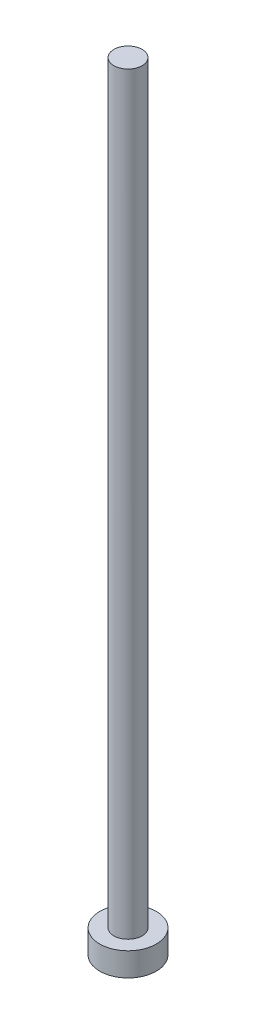
ISO-10303-21;
HEADER;
FILE_DESCRIPTION(('STEP AP214'),'2;1');
FILE_NAME('part.step','',(''),(''),'','','');
FILE_SCHEMA(('AUTOMOTIVE_DESIGN { 1 0 10303 214 1 1 1 1 }'));
ENDSEC;
DATA;
#1=APPLICATION_CONTEXT('core data for automotive mechanical design processes');
#2=APPLICATION_PROTOCOL_DEFINITION('international standard','automotive_design',2000,#1);
#3=PRODUCT_CONTEXT('',#1,'mechanical');
#4=PRODUCT('Part','Part','',(#3));
#5=PRODUCT_RELATED_PRODUCT_CATEGORY('part','',(#4));
#6=PRODUCT_DEFINITION_FORMATION('','',#4);
#7=PRODUCT_DEFINITION_CONTEXT('part definition',#1,'design');
#8=PRODUCT_DEFINITION('design','',#6,#7);
#9=PRODUCT_DEFINITION_SHAPE('','',#8);
#10=(LENGTH_UNIT() NAMED_UNIT(*) SI_UNIT(.MILLI.,.METRE.));
#11=(NAMED_UNIT(*) PLANE_ANGLE_UNIT() SI_UNIT($,.RADIAN.));
#12=(NAMED_UNIT(*) SI_UNIT($,.STERADIAN.) SOLID_ANGLE_UNIT());
#13=UNCERTAINTY_MEASURE_WITH_UNIT(LENGTH_MEASURE(1.E-05),#10,'distance_accuracy_value','');
#14=(GEOMETRIC_REPRESENTATION_CONTEXT(3) GLOBAL_UNCERTAINTY_ASSIGNED_CONTEXT((#13)) GLOBAL_UNIT_ASSIGNED_CONTEXT((#10,
#11,#12)) REPRESENTATION_CONTEXT('',''));
#15=CARTESIAN_POINT('',(0.,0.,0.));
#16=DIRECTION('',(0.,0.,1.));
#17=DIRECTION('',(1.,0.,0.));
#18=AXIS2_PLACEMENT_3D('',#15,#16,#17);
#19=CARTESIAN_POINT('',(0.,160.,0.));
#20=DIRECTION('',(0.,-1.,0.));
#21=DIRECTION('',(0.,0.,-1.));
#22=AXIS2_PLACEMENT_3D('',#19,#20,#21);
#23=CYLINDRICAL_SURFACE('',#22,3.);
#24=CARTESIAN_POINT('',(0.,160.,0.));
#25=DIRECTION('',(0.,1.,0.));
#26=DIRECTION('',(0.,0.,1.));
#27=AXIS2_PLACEMENT_3D('',#24,#25,#26);
#28=CIRCLE('',#27,3.);
#29=CARTESIAN_POINT('',(0.,160.,3.));
#30=VERTEX_POINT('',#29);
#31=EDGE_CURVE('E10',#30,#30,#28,.T.);
#32=ORIENTED_EDGE('',*,*,#31,.F.);
#33=EDGE_LOOP('',(#32));
#34=FACE_BOUND('',#33,.T.);
#35=CARTESIAN_POINT('',(0.,0.,0.));
#36=DIRECTION('',(0.,-1.,0.));
#37=DIRECTION('',(0.,0.,-1.));
#38=AXIS2_PLACEMENT_3D('',#35,#36,#37);
#39=CIRCLE('',#38,3.);
#40=CARTESIAN_POINT('',(0.,0.,-3.));
#41=VERTEX_POINT('',#40);
#42=EDGE_CURVE('E42',#41,#41,#39,.T.);
#43=ORIENTED_EDGE('',*,*,#42,.F.);
#44=EDGE_LOOP('',(#43));
#45=FACE_BOUND('',#44,.T.);
#46=ADVANCED_FACE('F36',(#34,#45),#23,.T.);
#47=CARTESIAN_POINT('',(0.,160.,0.));
#48=DIRECTION('',(0.,1.,0.));
#49=DIRECTION('',(0.,0.,1.));
#50=AXIS2_PLACEMENT_3D('',#47,#48,#49);
#51=PLANE('',#50);
#52=ORIENTED_EDGE('',*,*,#31,.T.);
#53=EDGE_LOOP('',(#52));
#54=FACE_BOUND('',#53,.T.);
#55=ADVANCED_FACE('F69',(#54),#51,.T.);
#56=CARTESIAN_POINT('',(0.,-5.,0.));
#57=DIRECTION('',(0.,1.,0.));
#58=DIRECTION('',(0.,0.,1.));
#59=AXIS2_PLACEMENT_3D('',#56,#57,#58);
#60=CYLINDRICAL_SURFACE('',#59,6.);
#61=CARTESIAN_POINT('',(0.,-5.,0.));
#62=DIRECTION('',(0.,-1.,0.));
#63=DIRECTION('',(0.,0.,-1.));
#64=AXIS2_PLACEMENT_3D('',#61,#62,#63);
#65=CIRCLE('',#64,6.);
#66=CARTESIAN_POINT('',(0.,-5.,-6.));
#67=VERTEX_POINT('',#66);
#68=EDGE_CURVE('E46',#67,#67,#65,.T.);
#69=ORIENTED_EDGE('',*,*,#68,.F.);
#70=EDGE_LOOP('',(#69));
#71=FACE_BOUND('',#70,.T.);
#72=CARTESIAN_POINT('',(0.,0.,0.));
#73=DIRECTION('',(0.,-1.,0.));
#74=DIRECTION('',(0.,0.,-1.));
#75=AXIS2_PLACEMENT_3D('',#72,#73,#74);
#76=CIRCLE('',#75,6.);
#77=CARTESIAN_POINT('',(0.,0.,-6.));
#78=VERTEX_POINT('',#77);
#79=EDGE_CURVE('E50',#78,#78,#76,.T.);
#80=ORIENTED_EDGE('',*,*,#79,.T.);
#81=EDGE_LOOP('',(#80));
#82=FACE_BOUND('',#81,.T.);
#83=ADVANCED_FACE('F56',(#71,#82),#60,.T.);
#84=CARTESIAN_POINT('',(0.,-5.,0.));
#85=DIRECTION('',(0.,-1.,0.));
#86=DIRECTION('',(0.,0.,-1.));
#87=AXIS2_PLACEMENT_3D('',#84,#85,#86);
#88=PLANE('',#87);
#89=ORIENTED_EDGE('',*,*,#68,.T.);
#90=EDGE_LOOP('',(#89));
#91=FACE_BOUND('',#90,.T.);
#92=ADVANCED_FACE('F60',(#91),#88,.T.);
#93=CARTESIAN_POINT('',(0.,0.,0.));
#94=DIRECTION('',(0.,-1.,0.));
#95=DIRECTION('',(0.,0.,-1.));
#96=AXIS2_PLACEMENT_3D('',#93,#94,#95);
#97=PLANE('',#96);
#98=ORIENTED_EDGE('',*,*,#42,.T.);
#99=EDGE_LOOP('',(#98));
#100=FACE_BOUND('',#99,.T.);
#101=ORIENTED_EDGE('',*,*,#79,.F.);
#102=EDGE_LOOP('',(#101));
#103=FACE_BOUND('',#102,.T.);
#104=ADVANCED_FACE('F58',(#100,#103),#97,.F.);
#105=CLOSED_SHELL('',(#46,#55,#83,#92,#104));
#106=MANIFOLD_SOLID_BREP('B2',#105);
#107=ADVANCED_BREP_SHAPE_REPRESENTATION('',(#18,#106),#14);
#108=SHAPE_DEFINITION_REPRESENTATION(#9,#107);
ENDSEC;
END-ISO-10303-21;
